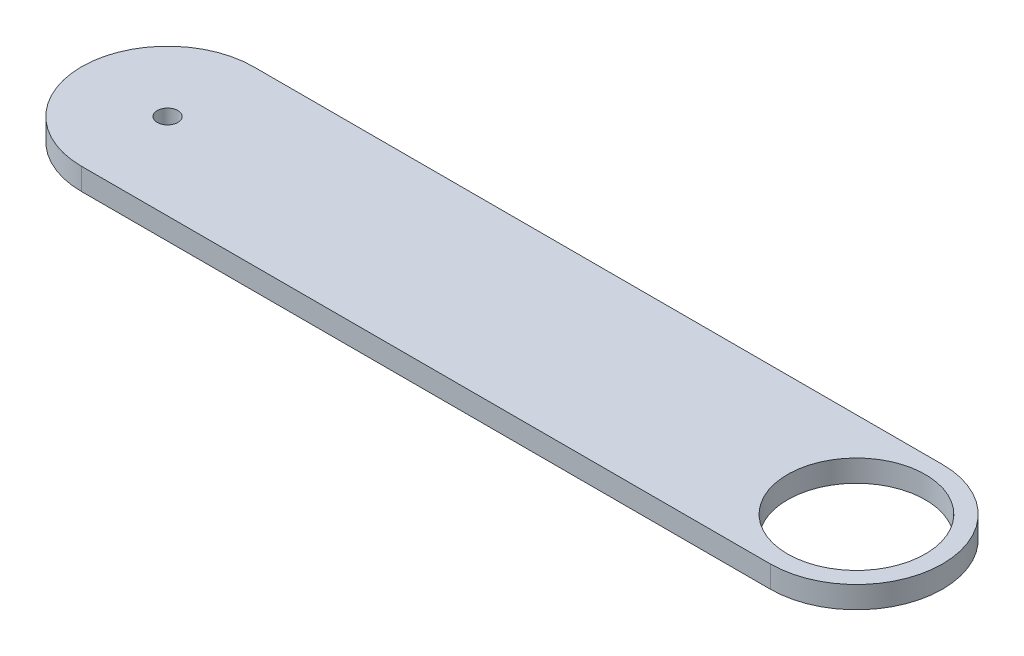
ISO-10303-21;
HEADER;
FILE_DESCRIPTION(('STEP AP214'),'2;1');
FILE_NAME('part.step','',(''),(''),'','','');
FILE_SCHEMA(('AUTOMOTIVE_DESIGN { 1 0 10303 214 1 1 1 1 }'));
ENDSEC;
DATA;
#1=APPLICATION_CONTEXT('core data for automotive mechanical design processes');
#2=APPLICATION_PROTOCOL_DEFINITION('international standard','automotive_design',2000,#1);
#3=PRODUCT_CONTEXT('',#1,'mechanical');
#4=PRODUCT('Part','Part','',(#3));
#5=PRODUCT_RELATED_PRODUCT_CATEGORY('part','',(#4));
#6=PRODUCT_DEFINITION_FORMATION('','',#4);
#7=PRODUCT_DEFINITION_CONTEXT('part definition',#1,'design');
#8=PRODUCT_DEFINITION('design','',#6,#7);
#9=PRODUCT_DEFINITION_SHAPE('','',#8);
#10=(LENGTH_UNIT() NAMED_UNIT(*) SI_UNIT(.MILLI.,.METRE.));
#11=(NAMED_UNIT(*) PLANE_ANGLE_UNIT() SI_UNIT($,.RADIAN.));
#12=(NAMED_UNIT(*) SI_UNIT($,.STERADIAN.) SOLID_ANGLE_UNIT());
#13=UNCERTAINTY_MEASURE_WITH_UNIT(LENGTH_MEASURE(1.E-05),#10,'distance_accuracy_value','');
#14=(GEOMETRIC_REPRESENTATION_CONTEXT(3) GLOBAL_UNCERTAINTY_ASSIGNED_CONTEXT((#13)) GLOBAL_UNIT_ASSIGNED_CONTEXT((#10,
#11,#12)) REPRESENTATION_CONTEXT('',''));
#15=CARTESIAN_POINT('',(0.,0.,0.));
#16=DIRECTION('',(0.,0.,1.));
#17=DIRECTION('',(1.,0.,0.));
#18=AXIS2_PLACEMENT_3D('',#15,#16,#17);
#19=CARTESIAN_POINT('',(0.,3.18,12.5));
#20=DIRECTION('',(0.,-1.,0.));
#21=DIRECTION('',(0.,0.,-1.));
#22=AXIS2_PLACEMENT_3D('',#19,#20,#21);
#23=CYLINDRICAL_SURFACE('',#22,12.5);
#24=CARTESIAN_POINT('',(0.,0.,12.5));
#25=DIRECTION('',(0.,1.,0.));
#26=DIRECTION('',(0.,0.,1.));
#27=AXIS2_PLACEMENT_3D('',#24,#25,#26);
#28=CIRCLE('',#27,12.5);
#29=CARTESIAN_POINT('',(0.,0.,0.));
#30=VERTEX_POINT('',#29);
#31=CARTESIAN_POINT('',(0.,0.,25.));
#32=VERTEX_POINT('',#31);
#33=EDGE_CURVE('E96',#30,#32,#28,.T.);
#34=ORIENTED_EDGE('',*,*,#33,.T.);
#35=DIRECTION('',(0.,-1.,0.));
#36=VECTOR('',#35,1.);
#37=CARTESIAN_POINT('',(0.,3.18,25.));
#38=LINE('',#37,#36);
#39=CARTESIAN_POINT('',(0.,3.18,25.));
#40=VERTEX_POINT('',#39);
#41=EDGE_CURVE('E11',#40,#32,#38,.T.);
#42=ORIENTED_EDGE('',*,*,#41,.F.);
#43=CARTESIAN_POINT('',(0.,3.18,12.5));
#44=DIRECTION('',(0.,1.,0.));
#45=DIRECTION('',(0.,0.,1.));
#46=AXIS2_PLACEMENT_3D('',#43,#44,#45);
#47=CIRCLE('',#46,12.5);
#48=CARTESIAN_POINT('',(0.,3.18,0.));
#49=VERTEX_POINT('',#48);
#50=EDGE_CURVE('E84',#49,#40,#47,.T.);
#51=ORIENTED_EDGE('',*,*,#50,.F.);
#52=DIRECTION('',(0.,-1.,0.));
#53=VECTOR('',#52,1.);
#54=CARTESIAN_POINT('',(0.,3.18,0.));
#55=LINE('',#54,#53);
#56=EDGE_CURVE('E92',#49,#30,#55,.T.);
#57=ORIENTED_EDGE('',*,*,#56,.T.);
#58=EDGE_LOOP('',(#34,#42,#51,#57));
#59=FACE_BOUND('',#58,.T.);
#60=ADVANCED_FACE('F33',(#59),#23,.T.);
#61=CARTESIAN_POINT('',(100.,3.18,25.));
#62=DIRECTION('',(0.,0.,-1.));
#63=DIRECTION('',(-1.,0.,0.));
#64=AXIS2_PLACEMENT_3D('',#61,#62,#63);
#65=PLANE('',#64);
#66=DIRECTION('',(1.,0.,0.));
#67=VECTOR('',#66,1.);
#68=CARTESIAN_POINT('',(100.,0.,25.));
#69=LINE('',#68,#67);
#70=CARTESIAN_POINT('',(100.,0.,25.));
#71=VERTEX_POINT('',#70);
#72=EDGE_CURVE('E88',#32,#71,#69,.T.);
#73=ORIENTED_EDGE('',*,*,#72,.T.);
#74=DIRECTION('',(0.,-1.,0.));
#75=VECTOR('',#74,1.);
#76=CARTESIAN_POINT('',(100.,3.18,25.));
#77=LINE('',#76,#75);
#78=CARTESIAN_POINT('',(100.,3.18,25.));
#79=VERTEX_POINT('',#78);
#80=EDGE_CURVE('E41',#79,#71,#77,.T.);
#81=ORIENTED_EDGE('',*,*,#80,.F.);
#82=DIRECTION('',(1.,0.,0.));
#83=VECTOR('',#82,1.);
#84=CARTESIAN_POINT('',(100.,3.18,25.));
#85=LINE('',#84,#83);
#86=EDGE_CURVE('E79',#40,#79,#85,.T.);
#87=ORIENTED_EDGE('',*,*,#86,.F.);
#88=ORIENTED_EDGE('',*,*,#41,.T.);
#89=EDGE_LOOP('',(#73,#81,#87,#88));
#90=FACE_BOUND('',#89,.T.);
#91=ADVANCED_FACE('F87',(#90),#65,.F.);
#92=CARTESIAN_POINT('',(100.,3.18,12.5));
#93=DIRECTION('',(0.,-1.,0.));
#94=DIRECTION('',(0.,0.,-1.));
#95=AXIS2_PLACEMENT_3D('',#92,#93,#94);
#96=CYLINDRICAL_SURFACE('',#95,12.5);
#97=CARTESIAN_POINT('',(100.,0.,12.5));
#98=DIRECTION('',(0.,1.,0.));
#99=DIRECTION('',(0.,0.,1.));
#100=AXIS2_PLACEMENT_3D('',#97,#98,#99);
#101=CIRCLE('',#100,12.5);
#102=CARTESIAN_POINT('',(100.,0.,0.));
#103=VERTEX_POINT('',#102);
#104=EDGE_CURVE('E66',#71,#103,#101,.T.);
#105=ORIENTED_EDGE('',*,*,#104,.T.);
#106=DIRECTION('',(0.,-1.,0.));
#107=VECTOR('',#106,1.);
#108=CARTESIAN_POINT('',(100.,3.18,0.));
#109=LINE('',#108,#107);
#110=CARTESIAN_POINT('',(100.,3.18,0.));
#111=VERTEX_POINT('',#110);
#112=EDGE_CURVE('E89',#111,#103,#109,.T.);
#113=ORIENTED_EDGE('',*,*,#112,.F.);
#114=CARTESIAN_POINT('',(100.,3.18,12.5));
#115=DIRECTION('',(0.,1.,0.));
#116=DIRECTION('',(0.,0.,1.));
#117=AXIS2_PLACEMENT_3D('',#114,#115,#116);
#118=CIRCLE('',#117,12.5);
#119=EDGE_CURVE('E82',#79,#111,#118,.T.);
#120=ORIENTED_EDGE('',*,*,#119,.F.);
#121=ORIENTED_EDGE('',*,*,#80,.T.);
#122=EDGE_LOOP('',(#105,#113,#120,#121));
#123=FACE_BOUND('',#122,.T.);
#124=ADVANCED_FACE('F90',(#123),#96,.T.);
#125=CARTESIAN_POINT('',(0.,3.18,0.));
#126=DIRECTION('',(0.,0.,1.));
#127=DIRECTION('',(1.,0.,0.));
#128=AXIS2_PLACEMENT_3D('',#125,#126,#127);
#129=PLANE('',#128);
#130=DIRECTION('',(-1.,0.,0.));
#131=VECTOR('',#130,1.);
#132=CARTESIAN_POINT('',(0.,0.,0.));
#133=LINE('',#132,#131);
#134=EDGE_CURVE('E72',#103,#30,#133,.T.);
#135=ORIENTED_EDGE('',*,*,#134,.T.);
#136=ORIENTED_EDGE('',*,*,#56,.F.);
#137=DIRECTION('',(-1.,0.,0.));
#138=VECTOR('',#137,1.);
#139=CARTESIAN_POINT('',(0.,3.18,0.));
#140=LINE('',#139,#138);
#141=EDGE_CURVE('E49',#111,#49,#140,.T.);
#142=ORIENTED_EDGE('',*,*,#141,.F.);
#143=ORIENTED_EDGE('',*,*,#112,.T.);
#144=EDGE_LOOP('',(#135,#136,#142,#143));
#145=FACE_BOUND('',#144,.T.);
#146=ADVANCED_FACE('F104',(#145),#129,.F.);
#147=CARTESIAN_POINT('',(0.,3.18,12.5));
#148=DIRECTION('',(0.,1.,0.));
#149=DIRECTION('',(0.,0.,1.));
#150=AXIS2_PLACEMENT_3D('',#147,#148,#149);
#151=PLANE('',#150);
#152=CARTESIAN_POINT('',(0.,3.18,12.5));
#153=DIRECTION('',(0.,1.,0.));
#154=DIRECTION('',(0.,0.,1.));
#155=AXIS2_PLACEMENT_3D('',#152,#153,#154);
#156=CIRCLE('',#155,1.5);
#157=CARTESIAN_POINT('',(0.,3.18,14.));
#158=VERTEX_POINT('',#157);
#159=EDGE_CURVE('E116',#158,#158,#156,.T.);
#160=ORIENTED_EDGE('',*,*,#159,.F.);
#161=EDGE_LOOP('',(#160));
#162=FACE_BOUND('',#161,.T.);
#163=CARTESIAN_POINT('',(100.,3.18,12.5));
#164=DIRECTION('',(0.,1.,0.));
#165=DIRECTION('',(0.,0.,1.));
#166=AXIS2_PLACEMENT_3D('',#163,#164,#165);
#167=CIRCLE('',#166,9.99999999999999);
#168=CARTESIAN_POINT('',(100.,3.18,22.5));
#169=VERTEX_POINT('',#168);
#170=EDGE_CURVE('E110',#169,#169,#167,.T.);
#171=ORIENTED_EDGE('',*,*,#170,.F.);
#172=EDGE_LOOP('',(#171));
#173=FACE_BOUND('',#172,.T.);
#174=ORIENTED_EDGE('',*,*,#50,.T.);
#175=ORIENTED_EDGE('',*,*,#86,.T.);
#176=ORIENTED_EDGE('',*,*,#119,.T.);
#177=ORIENTED_EDGE('',*,*,#141,.T.);
#178=EDGE_LOOP('',(#174,#175,#176,#177));
#179=FACE_BOUND('',#178,.T.);
#180=ADVANCED_FACE('F80',(#162,#173,#179),#151,.T.);
#181=CARTESIAN_POINT('',(0.,0.,12.5));
#182=DIRECTION('',(0.,1.,0.));
#183=DIRECTION('',(0.,0.,1.));
#184=AXIS2_PLACEMENT_3D('',#181,#182,#183);
#185=PLANE('',#184);
#186=CARTESIAN_POINT('',(0.,0.,12.5));
#187=DIRECTION('',(0.,1.,0.));
#188=DIRECTION('',(0.,0.,1.));
#189=AXIS2_PLACEMENT_3D('',#186,#187,#188);
#190=CIRCLE('',#189,1.5);
#191=CARTESIAN_POINT('',(0.,0.,14.));
#192=VERTEX_POINT('',#191);
#193=EDGE_CURVE('E99',#192,#192,#190,.T.);
#194=ORIENTED_EDGE('',*,*,#193,.T.);
#195=EDGE_LOOP('',(#194));
#196=FACE_BOUND('',#195,.T.);
#197=CARTESIAN_POINT('',(100.,0.,12.5));
#198=DIRECTION('',(0.,1.,0.));
#199=DIRECTION('',(0.,0.,1.));
#200=AXIS2_PLACEMENT_3D('',#197,#198,#199);
#201=CIRCLE('',#200,9.99999999999999);
#202=CARTESIAN_POINT('',(100.,0.,22.5));
#203=VERTEX_POINT('',#202);
#204=EDGE_CURVE('E113',#203,#203,#201,.T.);
#205=ORIENTED_EDGE('',*,*,#204,.T.);
#206=EDGE_LOOP('',(#205));
#207=FACE_BOUND('',#206,.T.);
#208=ORIENTED_EDGE('',*,*,#33,.F.);
#209=ORIENTED_EDGE('',*,*,#134,.F.);
#210=ORIENTED_EDGE('',*,*,#104,.F.);
#211=ORIENTED_EDGE('',*,*,#72,.F.);
#212=EDGE_LOOP('',(#208,#209,#210,#211));
#213=FACE_BOUND('',#212,.T.);
#214=ADVANCED_FACE('F107',(#196,#207,#213),#185,.F.);
#215=CARTESIAN_POINT('',(100.,0.,12.5));
#216=DIRECTION('',(0.,1.,0.));
#217=DIRECTION('',(0.,0.,1.));
#218=AXIS2_PLACEMENT_3D('',#215,#216,#217);
#219=CYLINDRICAL_SURFACE('',#218,9.99999999999999);
#220=CARTESIAN_POINT('',(100.,0.,22.5));
#221=CARTESIAN_POINT('',(100.,0.033125,22.5));
#222=CARTESIAN_POINT('',(100.,0.06625,22.5));
#223=CARTESIAN_POINT('',(100.,0.1325,22.5));
#224=CARTESIAN_POINT('',(100.,0.165625,22.5));
#225=CARTESIAN_POINT('',(100.,0.231875,22.5));
#226=CARTESIAN_POINT('',(100.,0.265,22.5));
#227=CARTESIAN_POINT('',(100.,0.33125,22.5));
#228=CARTESIAN_POINT('',(100.,0.364375,22.5));
#229=CARTESIAN_POINT('',(100.,0.430625,22.5));
#230=CARTESIAN_POINT('',(100.,0.46375,22.5));
#231=CARTESIAN_POINT('',(100.,0.53,22.5));
#232=CARTESIAN_POINT('',(100.,0.563125,22.5));
#233=CARTESIAN_POINT('',(100.,0.629375,22.5));
#234=CARTESIAN_POINT('',(100.,0.6625,22.5));
#235=CARTESIAN_POINT('',(100.,0.72875,22.5));
#236=CARTESIAN_POINT('',(100.,0.761875,22.5));
#237=CARTESIAN_POINT('',(100.,0.828125,22.5));
#238=CARTESIAN_POINT('',(100.,0.86125,22.5));
#239=CARTESIAN_POINT('',(100.,0.9275,22.5));
#240=CARTESIAN_POINT('',(100.,0.960625,22.5));
#241=CARTESIAN_POINT('',(100.,1.026875,22.5));
#242=CARTESIAN_POINT('',(100.,1.06,22.5));
#243=CARTESIAN_POINT('',(100.,1.12625,22.5));
#244=CARTESIAN_POINT('',(100.,1.159375,22.5));
#245=CARTESIAN_POINT('',(100.,1.225625,22.5));
#246=CARTESIAN_POINT('',(100.,1.25875,22.5));
#247=CARTESIAN_POINT('',(100.,1.325,22.5));
#248=CARTESIAN_POINT('',(100.,1.358125,22.5));
#249=CARTESIAN_POINT('',(100.,1.424375,22.5));
#250=CARTESIAN_POINT('',(100.,1.4575,22.5));
#251=CARTESIAN_POINT('',(100.,1.52375,22.5));
#252=CARTESIAN_POINT('',(100.,1.556875,22.5));
#253=CARTESIAN_POINT('',(100.,1.623125,22.5));
#254=CARTESIAN_POINT('',(100.,1.65625,22.5));
#255=CARTESIAN_POINT('',(100.,1.7225,22.5));
#256=CARTESIAN_POINT('',(100.,1.755625,22.5));
#257=CARTESIAN_POINT('',(100.,1.821875,22.5));
#258=CARTESIAN_POINT('',(100.,1.855,22.5));
#259=CARTESIAN_POINT('',(100.,1.92125,22.5));
#260=CARTESIAN_POINT('',(100.,1.954375,22.5));
#261=CARTESIAN_POINT('',(100.,2.020625,22.5));
#262=CARTESIAN_POINT('',(100.,2.05375,22.5));
#263=CARTESIAN_POINT('',(100.,2.12,22.5));
#264=CARTESIAN_POINT('',(100.,2.153125,22.5));
#265=CARTESIAN_POINT('',(100.,2.219375,22.5));
#266=CARTESIAN_POINT('',(100.,2.2525,22.5));
#267=CARTESIAN_POINT('',(100.,2.31875,22.5));
#268=CARTESIAN_POINT('',(100.,2.351875,22.5));
#269=CARTESIAN_POINT('',(100.,2.418125,22.5));
#270=CARTESIAN_POINT('',(100.,2.45125,22.5));
#271=CARTESIAN_POINT('',(100.,2.5175,22.5));
#272=CARTESIAN_POINT('',(100.,2.550625,22.5));
#273=CARTESIAN_POINT('',(100.,2.616875,22.5));
#274=CARTESIAN_POINT('',(100.,2.65,22.5));
#275=CARTESIAN_POINT('',(100.,2.71625,22.5));
#276=CARTESIAN_POINT('',(100.,2.749375,22.5));
#277=CARTESIAN_POINT('',(100.,2.815625,22.5));
#278=CARTESIAN_POINT('',(100.,2.84875,22.5));
#279=CARTESIAN_POINT('',(100.,2.915,22.5));
#280=CARTESIAN_POINT('',(100.,2.948125,22.5));
#281=CARTESIAN_POINT('',(100.,3.014375,22.5));
#282=CARTESIAN_POINT('',(100.,3.0475,22.5));
#283=CARTESIAN_POINT('',(100.,3.11375,22.5));
#284=CARTESIAN_POINT('',(100.,3.146875,22.5));
#285=CARTESIAN_POINT('',(100.,3.18,22.5));
#286=B_SPLINE_CURVE_WITH_KNOTS('',3,(#220,#221,#222,#223,#224,#225,#226,#227,#228,#229,#230,
#231,#232,#233,#234,#235,#236,#237,#238,#239,#240,#241,#242,#243,#244,#245,#246,#247,#248,#249,
#250,#251,#252,#253,#254,#255,#256,#257,#258,#259,#260,#261,#262,#263,#264,#265,#266,#267,#268,
#269,#270,#271,#272,#273,#274,#275,#276,#277,#278,#279,#280,#281,#282,#283,#284,#285),
.UNSPECIFIED.,.F.,.F.,(4,2,2,2,2,2,2,2,2,2,2,2,2,2,2,2,2,2,2,2,2,2,2,2,2,2,2,2,2,2,2,2,4),(0.,
0.099375,0.19875,0.298125,0.3975,0.496875,0.59625,0.695625,0.795,0.894375,0.99375,1.093125,
1.1925,1.291875,1.39125,1.490625,1.59,1.689375,1.78875,1.888125,1.9875,2.086875,2.18625,
2.285625,2.385,2.484375,2.58375,2.683125,2.7825,2.881875,2.98125,3.080625,3.18),.UNSPECIFIED.);
#287=EDGE_CURVE('BSEAM127',#203,#169,#286,.T.);
#288=ORIENTED_EDGE('',*,*,#204,.F.);
#289=ORIENTED_EDGE('',*,*,#170,.T.);
#290=ORIENTED_EDGE('',*,*,#287,.T.);
#291=ORIENTED_EDGE('',*,*,#287,.F.);
#292=EDGE_LOOP('',(#288,#290,#289,#291));
#293=FACE_BOUND('',#292,.T.);
#294=ADVANCED_FACE('F127',(#293),#219,.F.);
#295=CARTESIAN_POINT('',(0.,0.,12.5));
#296=DIRECTION('',(0.,1.,0.));
#297=DIRECTION('',(0.,0.,1.));
#298=AXIS2_PLACEMENT_3D('',#295,#296,#297);
#299=CYLINDRICAL_SURFACE('',#298,1.5);
#300=CARTESIAN_POINT('',(0.,0.,14.));
#301=CARTESIAN_POINT('',(0.,0.033125,14.));
#302=CARTESIAN_POINT('',(0.,0.06625,14.));
#303=CARTESIAN_POINT('',(0.,0.1325,14.));
#304=CARTESIAN_POINT('',(0.,0.165625,14.));
#305=CARTESIAN_POINT('',(0.,0.231875,14.));
#306=CARTESIAN_POINT('',(0.,0.265,14.));
#307=CARTESIAN_POINT('',(0.,0.33125,14.));
#308=CARTESIAN_POINT('',(0.,0.364375,14.));
#309=CARTESIAN_POINT('',(0.,0.430625,14.));
#310=CARTESIAN_POINT('',(0.,0.46375,14.));
#311=CARTESIAN_POINT('',(0.,0.53,14.));
#312=CARTESIAN_POINT('',(0.,0.563125,14.));
#313=CARTESIAN_POINT('',(0.,0.629375,14.));
#314=CARTESIAN_POINT('',(0.,0.6625,14.));
#315=CARTESIAN_POINT('',(0.,0.72875,14.));
#316=CARTESIAN_POINT('',(0.,0.761875,14.));
#317=CARTESIAN_POINT('',(0.,0.828125,14.));
#318=CARTESIAN_POINT('',(0.,0.86125,14.));
#319=CARTESIAN_POINT('',(0.,0.9275,14.));
#320=CARTESIAN_POINT('',(0.,0.960625,14.));
#321=CARTESIAN_POINT('',(0.,1.026875,14.));
#322=CARTESIAN_POINT('',(0.,1.06,14.));
#323=CARTESIAN_POINT('',(0.,1.12625,14.));
#324=CARTESIAN_POINT('',(0.,1.159375,14.));
#325=CARTESIAN_POINT('',(0.,1.225625,14.));
#326=CARTESIAN_POINT('',(0.,1.25875,14.));
#327=CARTESIAN_POINT('',(0.,1.325,14.));
#328=CARTESIAN_POINT('',(0.,1.358125,14.));
#329=CARTESIAN_POINT('',(0.,1.424375,14.));
#330=CARTESIAN_POINT('',(0.,1.4575,14.));
#331=CARTESIAN_POINT('',(0.,1.52375,14.));
#332=CARTESIAN_POINT('',(0.,1.556875,14.));
#333=CARTESIAN_POINT('',(0.,1.623125,14.));
#334=CARTESIAN_POINT('',(0.,1.65625,14.));
#335=CARTESIAN_POINT('',(0.,1.7225,14.));
#336=CARTESIAN_POINT('',(0.,1.755625,14.));
#337=CARTESIAN_POINT('',(0.,1.821875,14.));
#338=CARTESIAN_POINT('',(0.,1.855,14.));
#339=CARTESIAN_POINT('',(0.,1.92125,14.));
#340=CARTESIAN_POINT('',(0.,1.954375,14.));
#341=CARTESIAN_POINT('',(0.,2.020625,14.));
#342=CARTESIAN_POINT('',(0.,2.05375,14.));
#343=CARTESIAN_POINT('',(0.,2.12,14.));
#344=CARTESIAN_POINT('',(0.,2.153125,14.));
#345=CARTESIAN_POINT('',(0.,2.219375,14.));
#346=CARTESIAN_POINT('',(0.,2.2525,14.));
#347=CARTESIAN_POINT('',(0.,2.31875,14.));
#348=CARTESIAN_POINT('',(0.,2.351875,14.));
#349=CARTESIAN_POINT('',(0.,2.418125,14.));
#350=CARTESIAN_POINT('',(0.,2.45125,14.));
#351=CARTESIAN_POINT('',(0.,2.5175,14.));
#352=CARTESIAN_POINT('',(0.,2.550625,14.));
#353=CARTESIAN_POINT('',(0.,2.616875,14.));
#354=CARTESIAN_POINT('',(0.,2.65,14.));
#355=CARTESIAN_POINT('',(0.,2.71625,14.));
#356=CARTESIAN_POINT('',(0.,2.749375,14.));
#357=CARTESIAN_POINT('',(0.,2.815625,14.));
#358=CARTESIAN_POINT('',(0.,2.84875,14.));
#359=CARTESIAN_POINT('',(0.,2.915,14.));
#360=CARTESIAN_POINT('',(0.,2.948125,14.));
#361=CARTESIAN_POINT('',(0.,3.014375,14.));
#362=CARTESIAN_POINT('',(0.,3.0475,14.));
#363=CARTESIAN_POINT('',(0.,3.11375,14.));
#364=CARTESIAN_POINT('',(0.,3.146875,14.));
#365=CARTESIAN_POINT('',(0.,3.18,14.));
#366=B_SPLINE_CURVE_WITH_KNOTS('',3,(#300,#301,#302,#303,#304,#305,#306,#307,#308,#309,#310,
#311,#312,#313,#314,#315,#316,#317,#318,#319,#320,#321,#322,#323,#324,#325,#326,#327,#328,#329,
#330,#331,#332,#333,#334,#335,#336,#337,#338,#339,#340,#341,#342,#343,#344,#345,#346,#347,#348,
#349,#350,#351,#352,#353,#354,#355,#356,#357,#358,#359,#360,#361,#362,#363,#364,#365),
.UNSPECIFIED.,.F.,.F.,(4,2,2,2,2,2,2,2,2,2,2,2,2,2,2,2,2,2,2,2,2,2,2,2,2,2,2,2,2,2,2,2,4),(0.,
0.099375,0.19875,0.298125,0.3975,0.496875,0.59625,0.695625,0.795,0.894375,0.99375,1.093125,
1.1925,1.291875,1.39125,1.490625,1.59,1.689375,1.78875,1.888125,1.9875,2.086875,2.18625,
2.285625,2.385,2.484375,2.58375,2.683125,2.7825,2.881875,2.98125,3.080625,3.18),.UNSPECIFIED.);
#367=EDGE_CURVE('BSEAM124',#192,#158,#366,.T.);
#368=ORIENTED_EDGE('',*,*,#193,.F.);
#369=ORIENTED_EDGE('',*,*,#159,.T.);
#370=ORIENTED_EDGE('',*,*,#367,.T.);
#371=ORIENTED_EDGE('',*,*,#367,.F.);
#372=EDGE_LOOP('',(#368,#370,#369,#371));
#373=FACE_BOUND('',#372,.T.);
#374=ADVANCED_FACE('F124',(#373),#299,.F.);
#375=CLOSED_SHELL('',(#60,#91,#124,#146,#180,#214,#294,#374));
#376=MANIFOLD_SOLID_BREP('B2',#375);
#377=ADVANCED_BREP_SHAPE_REPRESENTATION('',(#18,#376),#14);
#378=SHAPE_DEFINITION_REPRESENTATION(#9,#377);
ENDSEC;
END-ISO-10303-21;
